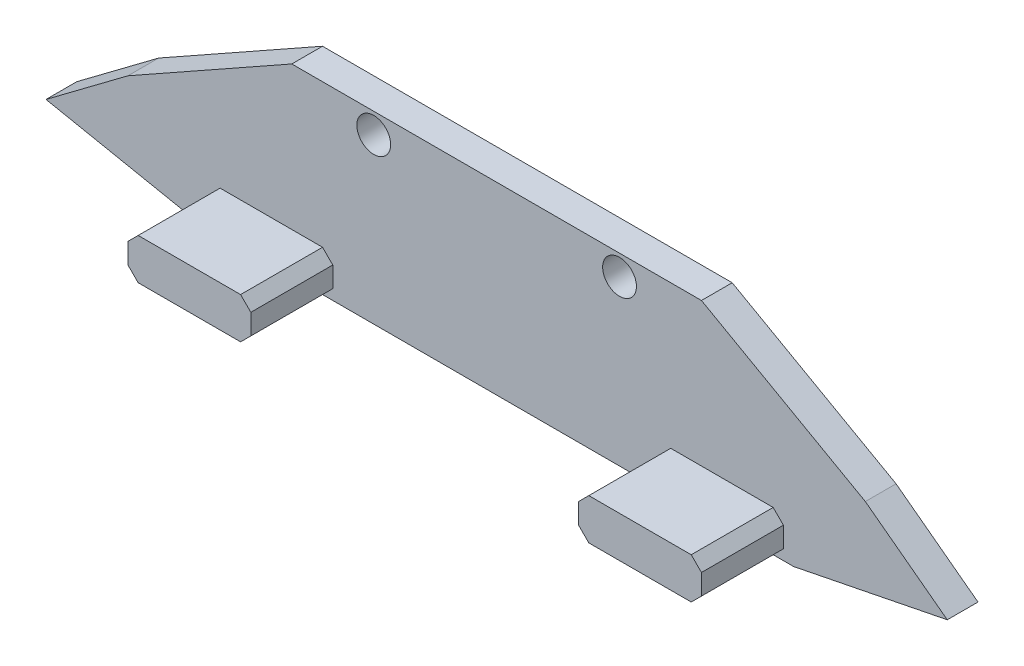
ISO-10303-21;
HEADER;
FILE_DESCRIPTION(('STEP AP214'),'2;1');
FILE_NAME('part.step','',(''),(''),'','','');
FILE_SCHEMA(('AUTOMOTIVE_DESIGN { 1 0 10303 214 1 1 1 1 }'));
ENDSEC;
DATA;
#1=APPLICATION_CONTEXT('core data for automotive mechanical design processes');
#2=APPLICATION_PROTOCOL_DEFINITION('international standard','automotive_design',2000,#1);
#3=PRODUCT_CONTEXT('',#1,'mechanical');
#4=PRODUCT('Part','Part','',(#3));
#5=PRODUCT_RELATED_PRODUCT_CATEGORY('part','',(#4));
#6=PRODUCT_DEFINITION_FORMATION('','',#4);
#7=PRODUCT_DEFINITION_CONTEXT('part definition',#1,'design');
#8=PRODUCT_DEFINITION('design','',#6,#7);
#9=PRODUCT_DEFINITION_SHAPE('','',#8);
#10=(LENGTH_UNIT() NAMED_UNIT(*) SI_UNIT(.MILLI.,.METRE.));
#11=(NAMED_UNIT(*) PLANE_ANGLE_UNIT() SI_UNIT($,.RADIAN.));
#12=(NAMED_UNIT(*) SI_UNIT($,.STERADIAN.) SOLID_ANGLE_UNIT());
#13=UNCERTAINTY_MEASURE_WITH_UNIT(LENGTH_MEASURE(1.E-05),#10,'distance_accuracy_value','');
#14=(GEOMETRIC_REPRESENTATION_CONTEXT(3) GLOBAL_UNCERTAINTY_ASSIGNED_CONTEXT((#13)) GLOBAL_UNIT_ASSIGNED_CONTEXT((#10,
#11,#12)) REPRESENTATION_CONTEXT('',''));
#15=CARTESIAN_POINT('',(0.,0.,0.));
#16=DIRECTION('',(0.,0.,1.));
#17=DIRECTION('',(1.,0.,0.));
#18=AXIS2_PLACEMENT_3D('',#15,#16,#17);
#19=CARTESIAN_POINT('',(0.,0.,3.));
#20=DIRECTION('',(0.,0.,-1.));
#21=DIRECTION('',(-1.,0.,0.));
#22=AXIS2_PLACEMENT_3D('',#19,#20,#21);
#23=PLANE('',#22);
#24=CARTESIAN_POINT('',(-12.,89.,3.));
#25=DIRECTION('',(0.,0.,1.));
#26=DIRECTION('',(1.,0.,0.));
#27=AXIS2_PLACEMENT_3D('',#24,#25,#26);
#28=CIRCLE('',#27,1.65);
#29=CARTESIAN_POINT('',(-10.35,89.,3.));
#30=VERTEX_POINT('',#29);
#31=EDGE_CURVE('E297',#30,#30,#28,.T.);
#32=ORIENTED_EDGE('',*,*,#31,.F.);
#33=EDGE_LOOP('',(#32));
#34=FACE_BOUND('',#33,.T.);
#35=CARTESIAN_POINT('',(12.,89.,3.));
#36=DIRECTION('',(0.,0.,1.));
#37=DIRECTION('',(1.,0.,0.));
#38=AXIS2_PLACEMENT_3D('',#35,#36,#37);
#39=CIRCLE('',#38,1.65);
#40=CARTESIAN_POINT('',(13.65,89.,3.));
#41=VERTEX_POINT('',#40);
#42=EDGE_CURVE('E291',#41,#41,#39,.T.);
#43=ORIENTED_EDGE('',*,*,#42,.F.);
#44=EDGE_LOOP('',(#43));
#45=FACE_BOUND('',#44,.T.);
#46=DIRECTION('',(0.707106781186547,-0.707106781186547,0.));
#47=VECTOR('',#46,1.);
#48=CARTESIAN_POINT('',(16.,74.,3.));
#49=LINE('',#48,#47);
#50=CARTESIAN_POINT('',(16.,74.,3.));
#51=VERTEX_POINT('',#50);
#52=CARTESIAN_POINT('',(17.,73.,3.));
#53=VERTEX_POINT('',#52);
#54=EDGE_CURVE('E222',#51,#53,#49,.T.);
#55=ORIENTED_EDGE('',*,*,#54,.F.);
#56=DIRECTION('',(0.,-1.,0.));
#57=VECTOR('',#56,1.);
#58=CARTESIAN_POINT('',(16.,76.,3.));
#59=LINE('',#58,#57);
#60=CARTESIAN_POINT('',(16.,76.,3.));
#61=VERTEX_POINT('',#60);
#62=EDGE_CURVE('E219',#61,#51,#59,.T.);
#63=ORIENTED_EDGE('',*,*,#62,.F.);
#64=DIRECTION('',(-0.707106781186547,-0.707106781186547,0.));
#65=VECTOR('',#64,1.);
#66=CARTESIAN_POINT('',(17.,77.,3.));
#67=LINE('',#66,#65);
#68=CARTESIAN_POINT('',(17.,77.,3.));
#69=VERTEX_POINT('',#68);
#70=EDGE_CURVE('E729',#69,#61,#67,.T.);
#71=ORIENTED_EDGE('',*,*,#70,.F.);
#72=DIRECTION('',(-1.,0.,0.));
#73=VECTOR('',#72,1.);
#74=CARTESIAN_POINT('',(27.,77.,3.));
#75=LINE('',#74,#73);
#76=CARTESIAN_POINT('',(27.,77.,3.));
#77=VERTEX_POINT('',#76);
#78=EDGE_CURVE('E755',#77,#69,#75,.T.);
#79=ORIENTED_EDGE('',*,*,#78,.F.);
#80=DIRECTION('',(-0.707106781186547,0.707106781186547,0.));
#81=VECTOR('',#80,1.);
#82=CARTESIAN_POINT('',(28.,76.,3.));
#83=LINE('',#82,#81);
#84=CARTESIAN_POINT('',(28.,76.,3.));
#85=VERTEX_POINT('',#84);
#86=EDGE_CURVE('E58',#85,#77,#83,.T.);
#87=ORIENTED_EDGE('',*,*,#86,.F.);
#88=DIRECTION('',(0.,1.,0.));
#89=VECTOR('',#88,1.);
#90=CARTESIAN_POINT('',(28.,74.,3.));
#91=LINE('',#90,#89);
#92=CARTESIAN_POINT('',(28.,74.,3.));
#93=VERTEX_POINT('',#92);
#94=EDGE_CURVE('E53',#93,#85,#91,.T.);
#95=ORIENTED_EDGE('',*,*,#94,.F.);
#96=DIRECTION('',(0.707106781186547,0.707106781186547,0.));
#97=VECTOR('',#96,1.);
#98=CARTESIAN_POINT('',(27.,73.,3.));
#99=LINE('',#98,#97);
#100=CARTESIAN_POINT('',(27.,73.,3.));
#101=VERTEX_POINT('',#100);
#102=EDGE_CURVE('E379',#101,#93,#99,.T.);
#103=ORIENTED_EDGE('',*,*,#102,.F.);
#104=DIRECTION('',(1.,0.,0.));
#105=VECTOR('',#104,1.);
#106=CARTESIAN_POINT('',(-29.,73.,3.));
#107=LINE('',#106,#105);
#108=CARTESIAN_POINT('',(29.,73.,3.));
#109=VERTEX_POINT('',#108);
#110=EDGE_CURVE('E306',#101,#109,#107,.T.);
#111=ORIENTED_EDGE('',*,*,#110,.T.);
#112=DIRECTION('',(0.98058067569092,0.196116135138184,0.));
#113=VECTOR('',#112,1.);
#114=CARTESIAN_POINT('',(29.,73.,3.));
#115=LINE('',#114,#113);
#116=CARTESIAN_POINT('',(44.,76.,3.));
#117=VERTEX_POINT('',#116);
#118=EDGE_CURVE('E310',#109,#117,#115,.T.);
#119=ORIENTED_EDGE('',*,*,#118,.T.);
#120=DIRECTION('',(-0.8,0.6,0.));
#121=VECTOR('',#120,1.);
#122=CARTESIAN_POINT('',(44.,76.,3.));
#123=LINE('',#122,#121);
#124=CARTESIAN_POINT('',(36.,82.,3.));
#125=VERTEX_POINT('',#124);
#126=EDGE_CURVE('E313',#117,#125,#123,.T.);
#127=ORIENTED_EDGE('',*,*,#126,.T.);
#128=DIRECTION('',(-0.871575537124549,0.490261239632559,0.));
#129=VECTOR('',#128,1.);
#130=CARTESIAN_POINT('',(36.,82.,3.));
#131=LINE('',#130,#129);
#132=CARTESIAN_POINT('',(20.,91.,3.));
#133=VERTEX_POINT('',#132);
#134=EDGE_CURVE('E315',#125,#133,#131,.T.);
#135=ORIENTED_EDGE('',*,*,#134,.T.);
#136=DIRECTION('',(-1.,0.,0.));
#137=VECTOR('',#136,1.);
#138=CARTESIAN_POINT('',(20.,91.,3.));
#139=LINE('',#138,#137);
#140=CARTESIAN_POINT('',(-20.,91.,3.));
#141=VERTEX_POINT('',#140);
#142=EDGE_CURVE('E317',#133,#141,#139,.T.);
#143=ORIENTED_EDGE('',*,*,#142,.T.);
#144=DIRECTION('',(-0.871575537124549,-0.490261239632559,0.));
#145=VECTOR('',#144,1.);
#146=CARTESIAN_POINT('',(-20.,91.,3.));
#147=LINE('',#146,#145);
#148=CARTESIAN_POINT('',(-36.,82.,3.));
#149=VERTEX_POINT('',#148);
#150=EDGE_CURVE('E319',#141,#149,#147,.T.);
#151=ORIENTED_EDGE('',*,*,#150,.T.);
#152=DIRECTION('',(-0.8,-0.6,0.));
#153=VECTOR('',#152,1.);
#154=CARTESIAN_POINT('',(-36.,82.,3.));
#155=LINE('',#154,#153);
#156=CARTESIAN_POINT('',(-44.,76.,3.));
#157=VERTEX_POINT('',#156);
#158=EDGE_CURVE('E321',#149,#157,#155,.T.);
#159=ORIENTED_EDGE('',*,*,#158,.T.);
#160=DIRECTION('',(0.98058067569092,-0.196116135138184,0.));
#161=VECTOR('',#160,1.);
#162=CARTESIAN_POINT('',(-44.,76.,3.));
#163=LINE('',#162,#161);
#164=CARTESIAN_POINT('',(-29.,73.,3.));
#165=VERTEX_POINT('',#164);
#166=EDGE_CURVE('E303',#157,#165,#163,.T.);
#167=ORIENTED_EDGE('',*,*,#166,.T.);
#168=CARTESIAN_POINT('',(-27.,73.,3.));
#169=VERTEX_POINT('',#168);
#170=EDGE_CURVE('E308',#165,#169,#107,.T.);
#171=ORIENTED_EDGE('',*,*,#170,.T.);
#172=DIRECTION('',(0.707106781186547,-0.707106781186547,0.));
#173=VECTOR('',#172,1.);
#174=CARTESIAN_POINT('',(-28.,74.,3.));
#175=LINE('',#174,#173);
#176=CARTESIAN_POINT('',(-28.,74.,3.));
#177=VERTEX_POINT('',#176);
#178=EDGE_CURVE('E223',#177,#169,#175,.T.);
#179=ORIENTED_EDGE('',*,*,#178,.F.);
#180=DIRECTION('',(0.,-1.,0.));
#181=VECTOR('',#180,1.);
#182=CARTESIAN_POINT('',(-28.,76.,3.));
#183=LINE('',#182,#181);
#184=CARTESIAN_POINT('',(-28.,76.,3.));
#185=VERTEX_POINT('',#184);
#186=EDGE_CURVE('E236',#185,#177,#183,.T.);
#187=ORIENTED_EDGE('',*,*,#186,.F.);
#188=DIRECTION('',(-0.707106781186547,-0.707106781186547,0.));
#189=VECTOR('',#188,1.);
#190=CARTESIAN_POINT('',(-27.,77.,3.));
#191=LINE('',#190,#189);
#192=CARTESIAN_POINT('',(-27.,77.,3.));
#193=VERTEX_POINT('',#192);
#194=EDGE_CURVE('E262',#193,#185,#191,.T.);
#195=ORIENTED_EDGE('',*,*,#194,.F.);
#196=DIRECTION('',(-1.,0.,0.));
#197=VECTOR('',#196,1.);
#198=CARTESIAN_POINT('',(-17.,77.,3.));
#199=LINE('',#198,#197);
#200=CARTESIAN_POINT('',(-17.,77.,3.));
#201=VERTEX_POINT('',#200);
#202=EDGE_CURVE('E259',#201,#193,#199,.T.);
#203=ORIENTED_EDGE('',*,*,#202,.F.);
#204=DIRECTION('',(-0.707106781186547,0.707106781186547,0.));
#205=VECTOR('',#204,1.);
#206=CARTESIAN_POINT('',(-16.,76.,3.));
#207=LINE('',#206,#205);
#208=CARTESIAN_POINT('',(-16.,76.,3.));
#209=VERTEX_POINT('',#208);
#210=EDGE_CURVE('E256',#209,#201,#207,.T.);
#211=ORIENTED_EDGE('',*,*,#210,.F.);
#212=DIRECTION('',(0.,1.,0.));
#213=VECTOR('',#212,1.);
#214=CARTESIAN_POINT('',(-16.,74.,3.));
#215=LINE('',#214,#213);
#216=CARTESIAN_POINT('',(-16.,74.,3.));
#217=VERTEX_POINT('',#216);
#218=EDGE_CURVE('E253',#217,#209,#215,.T.);
#219=ORIENTED_EDGE('',*,*,#218,.F.);
#220=DIRECTION('',(0.707106781186547,0.707106781186547,0.));
#221=VECTOR('',#220,1.);
#222=CARTESIAN_POINT('',(-17.,73.,3.));
#223=LINE('',#222,#221);
#224=CARTESIAN_POINT('',(-17.,73.,3.));
#225=VERTEX_POINT('',#224);
#226=EDGE_CURVE('E226',#225,#217,#223,.T.);
#227=ORIENTED_EDGE('',*,*,#226,.F.);
#228=EDGE_CURVE('E311',#225,#53,#107,.T.);
#229=ORIENTED_EDGE('',*,*,#228,.T.);
#230=EDGE_LOOP('',(#55,#63,#71,#79,#87,#95,#103,#111,#119,#127,#135,#143,#151,#159,#167,#171,
#179,#187,#195,#203,#211,#219,#227,#229));
#231=FACE_BOUND('',#230,.T.);
#232=ADVANCED_FACE('F38',(#34,#45,#231),#23,.F.);
#233=CARTESIAN_POINT('',(0.,0.,0.));
#234=DIRECTION('',(0.,0.,-1.));
#235=DIRECTION('',(-1.,0.,0.));
#236=AXIS2_PLACEMENT_3D('',#233,#234,#235);
#237=PLANE('',#236);
#238=CARTESIAN_POINT('',(-12.,89.,0.));
#239=DIRECTION('',(0.,0.,1.));
#240=DIRECTION('',(1.,0.,0.));
#241=AXIS2_PLACEMENT_3D('',#238,#239,#240);
#242=CIRCLE('',#241,1.65);
#243=CARTESIAN_POINT('',(-10.35,89.,0.));
#244=VERTEX_POINT('',#243);
#245=EDGE_CURVE('E294',#244,#244,#242,.T.);
#246=ORIENTED_EDGE('',*,*,#245,.T.);
#247=EDGE_LOOP('',(#246));
#248=FACE_BOUND('',#247,.T.);
#249=DIRECTION('',(0.98058067569092,-0.196116135138184,0.));
#250=VECTOR('',#249,1.);
#251=CARTESIAN_POINT('',(-44.,76.,0.));
#252=LINE('',#251,#250);
#253=CARTESIAN_POINT('',(-44.,76.,0.));
#254=VERTEX_POINT('',#253);
#255=CARTESIAN_POINT('',(-29.,73.,0.));
#256=VERTEX_POINT('',#255);
#257=EDGE_CURVE('E300',#254,#256,#252,.T.);
#258=ORIENTED_EDGE('',*,*,#257,.F.);
#259=DIRECTION('',(-0.8,-0.6,0.));
#260=VECTOR('',#259,1.);
#261=CARTESIAN_POINT('',(-36.,82.,0.));
#262=LINE('',#261,#260);
#263=CARTESIAN_POINT('',(-36.,82.,0.));
#264=VERTEX_POINT('',#263);
#265=EDGE_CURVE('E307',#264,#254,#262,.T.);
#266=ORIENTED_EDGE('',*,*,#265,.F.);
#267=DIRECTION('',(-0.871575537124549,-0.490261239632559,0.));
#268=VECTOR('',#267,1.);
#269=CARTESIAN_POINT('',(-20.,91.,0.));
#270=LINE('',#269,#268);
#271=CARTESIAN_POINT('',(-20.,91.,0.));
#272=VERTEX_POINT('',#271);
#273=EDGE_CURVE('E336',#272,#264,#270,.T.);
#274=ORIENTED_EDGE('',*,*,#273,.F.);
#275=DIRECTION('',(-1.,0.,0.));
#276=VECTOR('',#275,1.);
#277=CARTESIAN_POINT('',(20.,91.,0.));
#278=LINE('',#277,#276);
#279=CARTESIAN_POINT('',(20.,91.,0.));
#280=VERTEX_POINT('',#279);
#281=EDGE_CURVE('E334',#280,#272,#278,.T.);
#282=ORIENTED_EDGE('',*,*,#281,.F.);
#283=DIRECTION('',(-0.871575537124549,0.490261239632559,0.));
#284=VECTOR('',#283,1.);
#285=CARTESIAN_POINT('',(36.,82.,0.));
#286=LINE('',#285,#284);
#287=CARTESIAN_POINT('',(36.,82.,0.));
#288=VERTEX_POINT('',#287);
#289=EDGE_CURVE('E332',#288,#280,#286,.T.);
#290=ORIENTED_EDGE('',*,*,#289,.F.);
#291=DIRECTION('',(-0.8,0.6,0.));
#292=VECTOR('',#291,1.);
#293=CARTESIAN_POINT('',(44.,76.,0.));
#294=LINE('',#293,#292);
#295=CARTESIAN_POINT('',(44.,76.,0.));
#296=VERTEX_POINT('',#295);
#297=EDGE_CURVE('E330',#296,#288,#294,.T.);
#298=ORIENTED_EDGE('',*,*,#297,.F.);
#299=DIRECTION('',(0.98058067569092,0.196116135138184,0.));
#300=VECTOR('',#299,1.);
#301=CARTESIAN_POINT('',(29.,73.,0.));
#302=LINE('',#301,#300);
#303=CARTESIAN_POINT('',(29.,73.,0.));
#304=VERTEX_POINT('',#303);
#305=EDGE_CURVE('E328',#304,#296,#302,.T.);
#306=ORIENTED_EDGE('',*,*,#305,.F.);
#307=DIRECTION('',(1.,0.,0.));
#308=VECTOR('',#307,1.);
#309=CARTESIAN_POINT('',(-29.,73.,0.));
#310=LINE('',#309,#308);
#311=EDGE_CURVE('E326',#256,#304,#310,.T.);
#312=ORIENTED_EDGE('',*,*,#311,.F.);
#313=EDGE_LOOP('',(#258,#266,#274,#282,#290,#298,#306,#312));
#314=FACE_BOUND('',#313,.T.);
#315=CARTESIAN_POINT('',(12.,89.,0.));
#316=DIRECTION('',(0.,0.,1.));
#317=DIRECTION('',(1.,0.,0.));
#318=AXIS2_PLACEMENT_3D('',#315,#316,#317);
#319=CIRCLE('',#318,1.65);
#320=CARTESIAN_POINT('',(13.65,89.,0.));
#321=VERTEX_POINT('',#320);
#322=EDGE_CURVE('E290',#321,#321,#319,.T.);
#323=ORIENTED_EDGE('',*,*,#322,.T.);
#324=EDGE_LOOP('',(#323));
#325=FACE_BOUND('',#324,.T.);
#326=ADVANCED_FACE('F365',(#248,#314,#325),#237,.T.);
#327=CARTESIAN_POINT('',(-44.,76.,3.));
#328=DIRECTION('',(0.196116135138184,0.98058067569092,0.));
#329=DIRECTION('',(-0.98058067569092,0.196116135138184,0.));
#330=AXIS2_PLACEMENT_3D('',#327,#328,#329);
#331=PLANE('',#330);
#332=ORIENTED_EDGE('',*,*,#257,.T.);
#333=DIRECTION('',(0.,0.,-1.));
#334=VECTOR('',#333,1.);
#335=CARTESIAN_POINT('',(-29.,73.,3.));
#336=LINE('',#335,#334);
#337=EDGE_CURVE('E11',#165,#256,#336,.T.);
#338=ORIENTED_EDGE('',*,*,#337,.F.);
#339=ORIENTED_EDGE('',*,*,#166,.F.);
#340=DIRECTION('',(0.,0.,-1.));
#341=VECTOR('',#340,1.);
#342=CARTESIAN_POINT('',(-44.,76.,3.));
#343=LINE('',#342,#341);
#344=EDGE_CURVE('E323',#157,#254,#343,.T.);
#345=ORIENTED_EDGE('',*,*,#344,.T.);
#346=EDGE_LOOP('',(#332,#338,#339,#345));
#347=FACE_BOUND('',#346,.T.);
#348=ADVANCED_FACE('F40',(#347),#331,.F.);
#349=CARTESIAN_POINT('',(-29.,73.,3.));
#350=DIRECTION('',(0.,1.,0.));
#351=DIRECTION('',(0.,0.,1.));
#352=AXIS2_PLACEMENT_3D('',#349,#350,#351);
#353=PLANE('',#352);
#354=ORIENTED_EDGE('',*,*,#311,.T.);
#355=DIRECTION('',(0.,0.,-1.));
#356=VECTOR('',#355,1.);
#357=CARTESIAN_POINT('',(29.,73.,3.));
#358=LINE('',#357,#356);
#359=EDGE_CURVE('E46',#109,#304,#358,.T.);
#360=ORIENTED_EDGE('',*,*,#359,.F.);
#361=ORIENTED_EDGE('',*,*,#110,.F.);
#362=DIRECTION('',(0.,0.,-1.));
#363=VECTOR('',#362,1.);
#364=CARTESIAN_POINT('',(27.,73.,11.));
#365=LINE('',#364,#363);
#366=CARTESIAN_POINT('',(27.,73.,11.));
#367=VERTEX_POINT('',#366);
#368=EDGE_CURVE('E206',#367,#101,#365,.T.);
#369=ORIENTED_EDGE('',*,*,#368,.F.);
#370=DIRECTION('',(1.,0.,0.));
#371=VECTOR('',#370,1.);
#372=CARTESIAN_POINT('',(17.,73.,11.));
#373=LINE('',#372,#371);
#374=CARTESIAN_POINT('',(17.,73.,11.));
#375=VERTEX_POINT('',#374);
#376=EDGE_CURVE('E198',#375,#367,#373,.T.);
#377=ORIENTED_EDGE('',*,*,#376,.F.);
#378=DIRECTION('',(0.,0.,-1.));
#379=VECTOR('',#378,1.);
#380=CARTESIAN_POINT('',(17.,73.,11.));
#381=LINE('',#380,#379);
#382=EDGE_CURVE('E203',#375,#53,#381,.T.);
#383=ORIENTED_EDGE('',*,*,#382,.T.);
#384=ORIENTED_EDGE('',*,*,#228,.F.);
#385=DIRECTION('',(0.,0.,-1.));
#386=VECTOR('',#385,1.);
#387=CARTESIAN_POINT('',(-17.,73.,11.));
#388=LINE('',#387,#386);
#389=CARTESIAN_POINT('',(-17.,73.,11.));
#390=VERTEX_POINT('',#389);
#391=EDGE_CURVE('E284',#390,#225,#388,.T.);
#392=ORIENTED_EDGE('',*,*,#391,.F.);
#393=DIRECTION('',(1.,0.,0.));
#394=VECTOR('',#393,1.);
#395=CARTESIAN_POINT('',(-27.,73.,11.));
#396=LINE('',#395,#394);
#397=CARTESIAN_POINT('',(-27.,73.,11.));
#398=VERTEX_POINT('',#397);
#399=EDGE_CURVE('E235',#398,#390,#396,.T.);
#400=ORIENTED_EDGE('',*,*,#399,.F.);
#401=DIRECTION('',(0.,0.,-1.));
#402=VECTOR('',#401,1.);
#403=CARTESIAN_POINT('',(-27.,73.,11.));
#404=LINE('',#403,#402);
#405=EDGE_CURVE('E287',#398,#169,#404,.T.);
#406=ORIENTED_EDGE('',*,*,#405,.T.);
#407=ORIENTED_EDGE('',*,*,#170,.F.);
#408=ORIENTED_EDGE('',*,*,#337,.T.);
#409=EDGE_LOOP('',(#354,#360,#361,#369,#377,#383,#384,#392,#400,#406,#407,#408));
#410=FACE_BOUND('',#409,.T.);
#411=ADVANCED_FACE('F200',(#410),#353,.F.);
#412=CARTESIAN_POINT('',(29.,73.,3.));
#413=DIRECTION('',(-0.196116135138184,0.98058067569092,0.));
#414=DIRECTION('',(-0.98058067569092,-0.196116135138184,0.));
#415=AXIS2_PLACEMENT_3D('',#412,#413,#414);
#416=PLANE('',#415);
#417=ORIENTED_EDGE('',*,*,#305,.T.);
#418=DIRECTION('',(0.,0.,-1.));
#419=VECTOR('',#418,1.);
#420=CARTESIAN_POINT('',(44.,76.,3.));
#421=LINE('',#420,#419);
#422=EDGE_CURVE('E353',#117,#296,#421,.T.);
#423=ORIENTED_EDGE('',*,*,#422,.F.);
#424=ORIENTED_EDGE('',*,*,#118,.F.);
#425=ORIENTED_EDGE('',*,*,#359,.T.);
#426=EDGE_LOOP('',(#417,#423,#424,#425));
#427=FACE_BOUND('',#426,.T.);
#428=ADVANCED_FACE('F360',(#427),#416,.F.);
#429=CARTESIAN_POINT('',(44.,76.,3.));
#430=DIRECTION('',(-0.6,-0.8,0.));
#431=DIRECTION('',(0.8,-0.6,0.));
#432=AXIS2_PLACEMENT_3D('',#429,#430,#431);
#433=PLANE('',#432);
#434=ORIENTED_EDGE('',*,*,#297,.T.);
#435=DIRECTION('',(0.,0.,-1.));
#436=VECTOR('',#435,1.);
#437=CARTESIAN_POINT('',(36.,82.,3.));
#438=LINE('',#437,#436);
#439=EDGE_CURVE('E350',#125,#288,#438,.T.);
#440=ORIENTED_EDGE('',*,*,#439,.F.);
#441=ORIENTED_EDGE('',*,*,#126,.F.);
#442=ORIENTED_EDGE('',*,*,#422,.T.);
#443=EDGE_LOOP('',(#434,#440,#441,#442));
#444=FACE_BOUND('',#443,.T.);
#445=ADVANCED_FACE('F371',(#444),#433,.F.);
#446=CARTESIAN_POINT('',(36.,82.,3.));
#447=DIRECTION('',(-0.490261239632559,-0.871575537124549,0.));
#448=DIRECTION('',(0.871575537124549,-0.490261239632559,0.));
#449=AXIS2_PLACEMENT_3D('',#446,#447,#448);
#450=PLANE('',#449);
#451=ORIENTED_EDGE('',*,*,#289,.T.);
#452=DIRECTION('',(0.,0.,-1.));
#453=VECTOR('',#452,1.);
#454=CARTESIAN_POINT('',(20.,91.,3.));
#455=LINE('',#454,#453);
#456=EDGE_CURVE('E347',#133,#280,#455,.T.);
#457=ORIENTED_EDGE('',*,*,#456,.F.);
#458=ORIENTED_EDGE('',*,*,#134,.F.);
#459=ORIENTED_EDGE('',*,*,#439,.T.);
#460=EDGE_LOOP('',(#451,#457,#458,#459));
#461=FACE_BOUND('',#460,.T.);
#462=ADVANCED_FACE('F375',(#461),#450,.F.);
#463=CARTESIAN_POINT('',(20.,91.,3.));
#464=DIRECTION('',(0.,-1.,0.));
#465=DIRECTION('',(0.,0.,-1.));
#466=AXIS2_PLACEMENT_3D('',#463,#464,#465);
#467=PLANE('',#466);
#468=ORIENTED_EDGE('',*,*,#281,.T.);
#469=DIRECTION('',(0.,0.,-1.));
#470=VECTOR('',#469,1.);
#471=CARTESIAN_POINT('',(-20.,91.,3.));
#472=LINE('',#471,#470);
#473=EDGE_CURVE('E344',#141,#272,#472,.T.);
#474=ORIENTED_EDGE('',*,*,#473,.F.);
#475=ORIENTED_EDGE('',*,*,#142,.F.);
#476=ORIENTED_EDGE('',*,*,#456,.T.);
#477=EDGE_LOOP('',(#468,#474,#475,#476));
#478=FACE_BOUND('',#477,.T.);
#479=ADVANCED_FACE('F441',(#478),#467,.F.);
#480=CARTESIAN_POINT('',(-20.,91.,3.));
#481=DIRECTION('',(0.490261239632559,-0.871575537124549,0.));
#482=DIRECTION('',(0.871575537124549,0.490261239632559,0.));
#483=AXIS2_PLACEMENT_3D('',#480,#481,#482);
#484=PLANE('',#483);
#485=ORIENTED_EDGE('',*,*,#273,.T.);
#486=DIRECTION('',(0.,0.,-1.));
#487=VECTOR('',#486,1.);
#488=CARTESIAN_POINT('',(-36.,82.,3.));
#489=LINE('',#488,#487);
#490=EDGE_CURVE('E341',#149,#264,#489,.T.);
#491=ORIENTED_EDGE('',*,*,#490,.F.);
#492=ORIENTED_EDGE('',*,*,#150,.F.);
#493=ORIENTED_EDGE('',*,*,#473,.T.);
#494=EDGE_LOOP('',(#485,#491,#492,#493));
#495=FACE_BOUND('',#494,.T.);
#496=ADVANCED_FACE('F437',(#495),#484,.F.);
#497=CARTESIAN_POINT('',(-36.,82.,3.));
#498=DIRECTION('',(0.6,-0.8,0.));
#499=DIRECTION('',(0.8,0.6,0.));
#500=AXIS2_PLACEMENT_3D('',#497,#498,#499);
#501=PLANE('',#500);
#502=ORIENTED_EDGE('',*,*,#265,.T.);
#503=ORIENTED_EDGE('',*,*,#344,.F.);
#504=ORIENTED_EDGE('',*,*,#158,.F.);
#505=ORIENTED_EDGE('',*,*,#490,.T.);
#506=EDGE_LOOP('',(#502,#503,#504,#505));
#507=FACE_BOUND('',#506,.T.);
#508=ADVANCED_FACE('F434',(#507),#501,.F.);
#509=CARTESIAN_POINT('',(-12.,89.,3.));
#510=DIRECTION('',(0.,0.,-1.));
#511=DIRECTION('',(-1.,0.,0.));
#512=AXIS2_PLACEMENT_3D('',#509,#510,#511);
#513=CYLINDRICAL_SURFACE('',#512,1.65);
#514=ORIENTED_EDGE('',*,*,#31,.T.);
#515=EDGE_LOOP('',(#514));
#516=FACE_BOUND('',#515,.T.);
#517=ORIENTED_EDGE('',*,*,#245,.F.);
#518=EDGE_LOOP('',(#517));
#519=FACE_BOUND('',#518,.T.);
#520=ADVANCED_FACE('F431',(#516,#519),#513,.F.);
#521=CARTESIAN_POINT('',(12.,89.,3.));
#522=DIRECTION('',(0.,0.,-1.));
#523=DIRECTION('',(-1.,0.,0.));
#524=AXIS2_PLACEMENT_3D('',#521,#522,#523);
#525=CYLINDRICAL_SURFACE('',#524,1.65);
#526=ORIENTED_EDGE('',*,*,#42,.T.);
#527=EDGE_LOOP('',(#526));
#528=FACE_BOUND('',#527,.T.);
#529=ORIENTED_EDGE('',*,*,#322,.F.);
#530=EDGE_LOOP('',(#529));
#531=FACE_BOUND('',#530,.T.);
#532=ADVANCED_FACE('F539',(#528,#531),#525,.F.);
#533=CARTESIAN_POINT('',(-28.,74.,11.));
#534=DIRECTION('',(0.707106781186547,0.707106781186547,0.));
#535=DIRECTION('',(-0.707106781186548,0.707106781186548,0.));
#536=AXIS2_PLACEMENT_3D('',#533,#534,#535);
#537=PLANE('',#536);
#538=ORIENTED_EDGE('',*,*,#178,.T.);
#539=ORIENTED_EDGE('',*,*,#405,.F.);
#540=DIRECTION('',(0.707106781186547,-0.707106781186547,0.));
#541=VECTOR('',#540,1.);
#542=CARTESIAN_POINT('',(-28.,74.,11.));
#543=LINE('',#542,#541);
#544=CARTESIAN_POINT('',(-28.,74.,11.));
#545=VERTEX_POINT('',#544);
#546=EDGE_CURVE('E232',#545,#398,#543,.T.);
#547=ORIENTED_EDGE('',*,*,#546,.F.);
#548=DIRECTION('',(0.,0.,-1.));
#549=VECTOR('',#548,1.);
#550=CARTESIAN_POINT('',(-28.,74.,11.));
#551=LINE('',#550,#549);
#552=EDGE_CURVE('E249',#545,#177,#551,.T.);
#553=ORIENTED_EDGE('',*,*,#552,.T.);
#554=EDGE_LOOP('',(#538,#539,#547,#553));
#555=FACE_BOUND('',#554,.T.);
#556=ADVANCED_FACE('F393',(#555),#537,.F.);
#557=CARTESIAN_POINT('',(-17.,73.,11.));
#558=DIRECTION('',(-0.707106781186547,0.707106781186547,0.));
#559=DIRECTION('',(-0.707106781186548,-0.707106781186548,0.));
#560=AXIS2_PLACEMENT_3D('',#557,#558,#559);
#561=PLANE('',#560);
#562=ORIENTED_EDGE('',*,*,#226,.T.);
#563=DIRECTION('',(0.,0.,-1.));
#564=VECTOR('',#563,1.);
#565=CARTESIAN_POINT('',(-16.,74.,11.));
#566=LINE('',#565,#564);
#567=CARTESIAN_POINT('',(-16.,74.,11.));
#568=VERTEX_POINT('',#567);
#569=EDGE_CURVE('E281',#568,#217,#566,.T.);
#570=ORIENTED_EDGE('',*,*,#569,.F.);
#571=DIRECTION('',(0.707106781186547,0.707106781186547,0.));
#572=VECTOR('',#571,1.);
#573=CARTESIAN_POINT('',(-17.,73.,11.));
#574=LINE('',#573,#572);
#575=EDGE_CURVE('E238',#390,#568,#574,.T.);
#576=ORIENTED_EDGE('',*,*,#575,.F.);
#577=ORIENTED_EDGE('',*,*,#391,.T.);
#578=EDGE_LOOP('',(#562,#570,#576,#577));
#579=FACE_BOUND('',#578,.T.);
#580=ADVANCED_FACE('F384',(#579),#561,.F.);
#581=CARTESIAN_POINT('',(-16.,74.,11.));
#582=DIRECTION('',(-1.,0.,0.));
#583=DIRECTION('',(0.,0.,1.));
#584=AXIS2_PLACEMENT_3D('',#581,#582,#583);
#585=PLANE('',#584);
#586=ORIENTED_EDGE('',*,*,#218,.T.);
#587=DIRECTION('',(0.,0.,-1.));
#588=VECTOR('',#587,1.);
#589=CARTESIAN_POINT('',(-16.,76.,11.));
#590=LINE('',#589,#588);
#591=CARTESIAN_POINT('',(-16.,76.,11.));
#592=VERTEX_POINT('',#591);
#593=EDGE_CURVE('E278',#592,#209,#590,.T.);
#594=ORIENTED_EDGE('',*,*,#593,.F.);
#595=DIRECTION('',(0.,1.,0.));
#596=VECTOR('',#595,1.);
#597=CARTESIAN_POINT('',(-16.,74.,11.));
#598=LINE('',#597,#596);
#599=EDGE_CURVE('E240',#568,#592,#598,.T.);
#600=ORIENTED_EDGE('',*,*,#599,.F.);
#601=ORIENTED_EDGE('',*,*,#569,.T.);
#602=EDGE_LOOP('',(#586,#594,#600,#601));
#603=FACE_BOUND('',#602,.T.);
#604=ADVANCED_FACE('F411',(#603),#585,.F.);
#605=CARTESIAN_POINT('',(-16.,76.,11.));
#606=DIRECTION('',(-0.707106781186547,-0.707106781186547,0.));
#607=DIRECTION('',(0.707106781186548,-0.707106781186548,0.));
#608=AXIS2_PLACEMENT_3D('',#605,#606,#607);
#609=PLANE('',#608);
#610=ORIENTED_EDGE('',*,*,#210,.T.);
#611=DIRECTION('',(0.,0.,-1.));
#612=VECTOR('',#611,1.);
#613=CARTESIAN_POINT('',(-17.,77.,11.));
#614=LINE('',#613,#612);
#615=CARTESIAN_POINT('',(-17.,77.,11.));
#616=VERTEX_POINT('',#615);
#617=EDGE_CURVE('E275',#616,#201,#614,.T.);
#618=ORIENTED_EDGE('',*,*,#617,.F.);
#619=DIRECTION('',(-0.707106781186547,0.707106781186547,0.));
#620=VECTOR('',#619,1.);
#621=CARTESIAN_POINT('',(-16.,76.,11.));
#622=LINE('',#621,#620);
#623=EDGE_CURVE('E242',#592,#616,#622,.T.);
#624=ORIENTED_EDGE('',*,*,#623,.F.);
#625=ORIENTED_EDGE('',*,*,#593,.T.);
#626=EDGE_LOOP('',(#610,#618,#624,#625));
#627=FACE_BOUND('',#626,.T.);
#628=ADVANCED_FACE('F409',(#627),#609,.F.);
#629=CARTESIAN_POINT('',(-17.,77.,11.));
#630=DIRECTION('',(0.,-1.,0.));
#631=DIRECTION('',(0.,0.,-1.));
#632=AXIS2_PLACEMENT_3D('',#629,#630,#631);
#633=PLANE('',#632);
#634=ORIENTED_EDGE('',*,*,#202,.T.);
#635=DIRECTION('',(0.,0.,-1.));
#636=VECTOR('',#635,1.);
#637=CARTESIAN_POINT('',(-27.,77.,11.));
#638=LINE('',#637,#636);
#639=CARTESIAN_POINT('',(-27.,77.,11.));
#640=VERTEX_POINT('',#639);
#641=EDGE_CURVE('E272',#640,#193,#638,.T.);
#642=ORIENTED_EDGE('',*,*,#641,.F.);
#643=DIRECTION('',(-1.,0.,0.));
#644=VECTOR('',#643,1.);
#645=CARTESIAN_POINT('',(-17.,77.,11.));
#646=LINE('',#645,#644);
#647=EDGE_CURVE('E244',#616,#640,#646,.T.);
#648=ORIENTED_EDGE('',*,*,#647,.F.);
#649=ORIENTED_EDGE('',*,*,#617,.T.);
#650=EDGE_LOOP('',(#634,#642,#648,#649));
#651=FACE_BOUND('',#650,.T.);
#652=ADVANCED_FACE('F404',(#651),#633,.F.);
#653=CARTESIAN_POINT('',(-27.,77.,11.));
#654=DIRECTION('',(0.707106781186547,-0.707106781186547,0.));
#655=DIRECTION('',(0.707106781186548,0.707106781186548,0.));
#656=AXIS2_PLACEMENT_3D('',#653,#654,#655);
#657=PLANE('',#656);
#658=ORIENTED_EDGE('',*,*,#194,.T.);
#659=DIRECTION('',(0.,0.,-1.));
#660=VECTOR('',#659,1.);
#661=CARTESIAN_POINT('',(-28.,76.,11.));
#662=LINE('',#661,#660);
#663=CARTESIAN_POINT('',(-28.,76.,11.));
#664=VERTEX_POINT('',#663);
#665=EDGE_CURVE('E269',#664,#185,#662,.T.);
#666=ORIENTED_EDGE('',*,*,#665,.F.);
#667=DIRECTION('',(-0.707106781186547,-0.707106781186547,0.));
#668=VECTOR('',#667,1.);
#669=CARTESIAN_POINT('',(-27.,77.,11.));
#670=LINE('',#669,#668);
#671=EDGE_CURVE('E246',#640,#664,#670,.T.);
#672=ORIENTED_EDGE('',*,*,#671,.F.);
#673=ORIENTED_EDGE('',*,*,#641,.T.);
#674=EDGE_LOOP('',(#658,#666,#672,#673));
#675=FACE_BOUND('',#674,.T.);
#676=ADVANCED_FACE('F401',(#675),#657,.F.);
#677=CARTESIAN_POINT('',(-28.,76.,11.));
#678=DIRECTION('',(1.,0.,0.));
#679=DIRECTION('',(0.,0.,-1.));
#680=AXIS2_PLACEMENT_3D('',#677,#678,#679);
#681=PLANE('',#680);
#682=ORIENTED_EDGE('',*,*,#186,.T.);
#683=ORIENTED_EDGE('',*,*,#552,.F.);
#684=DIRECTION('',(0.,-1.,0.));
#685=VECTOR('',#684,1.);
#686=CARTESIAN_POINT('',(-28.,76.,11.));
#687=LINE('',#686,#685);
#688=EDGE_CURVE('E248',#664,#545,#687,.T.);
#689=ORIENTED_EDGE('',*,*,#688,.F.);
#690=ORIENTED_EDGE('',*,*,#665,.T.);
#691=EDGE_LOOP('',(#682,#683,#689,#690));
#692=FACE_BOUND('',#691,.T.);
#693=ADVANCED_FACE('F396',(#692),#681,.F.);
#694=CARTESIAN_POINT('',(0.,0.,11.));
#695=DIRECTION('',(0.,0.,1.));
#696=DIRECTION('',(1.,0.,0.));
#697=AXIS2_PLACEMENT_3D('',#694,#695,#696);
#698=PLANE('',#697);
#699=ORIENTED_EDGE('',*,*,#546,.T.);
#700=ORIENTED_EDGE('',*,*,#399,.T.);
#701=ORIENTED_EDGE('',*,*,#575,.T.);
#702=ORIENTED_EDGE('',*,*,#599,.T.);
#703=ORIENTED_EDGE('',*,*,#623,.T.);
#704=ORIENTED_EDGE('',*,*,#647,.T.);
#705=ORIENTED_EDGE('',*,*,#671,.T.);
#706=ORIENTED_EDGE('',*,*,#688,.T.);
#707=EDGE_LOOP('',(#699,#700,#701,#702,#703,#704,#705,#706));
#708=FACE_BOUND('',#707,.T.);
#709=ADVANCED_FACE('F388',(#708),#698,.T.);
#710=CARTESIAN_POINT('',(16.,74.,11.));
#711=DIRECTION('',(0.707106781186547,0.707106781186547,0.));
#712=DIRECTION('',(-0.707106781186548,0.707106781186548,0.));
#713=AXIS2_PLACEMENT_3D('',#710,#711,#712);
#714=PLANE('',#713);
#715=ORIENTED_EDGE('',*,*,#54,.T.);
#716=ORIENTED_EDGE('',*,*,#382,.F.);
#717=DIRECTION('',(0.707106781186547,-0.707106781186547,0.));
#718=VECTOR('',#717,1.);
#719=CARTESIAN_POINT('',(16.,74.,11.));
#720=LINE('',#719,#718);
#721=CARTESIAN_POINT('',(16.,74.,11.));
#722=VERTEX_POINT('',#721);
#723=EDGE_CURVE('E210',#722,#375,#720,.T.);
#724=ORIENTED_EDGE('',*,*,#723,.F.);
#725=DIRECTION('',(0.,0.,-1.));
#726=VECTOR('',#725,1.);
#727=CARTESIAN_POINT('',(16.,74.,11.));
#728=LINE('',#727,#726);
#729=EDGE_CURVE('E725',#722,#51,#728,.T.);
#730=ORIENTED_EDGE('',*,*,#729,.T.);
#731=EDGE_LOOP('',(#715,#716,#724,#730));
#732=FACE_BOUND('',#731,.T.);
#733=ADVANCED_FACE('F221',(#732),#714,.F.);
#734=CARTESIAN_POINT('',(27.,73.,11.));
#735=DIRECTION('',(-0.707106781186547,0.707106781186547,0.));
#736=DIRECTION('',(-0.707106781186548,-0.707106781186548,0.));
#737=AXIS2_PLACEMENT_3D('',#734,#735,#736);
#738=PLANE('',#737);
#739=ORIENTED_EDGE('',*,*,#102,.T.);
#740=DIRECTION('',(0.,0.,-1.));
#741=VECTOR('',#740,1.);
#742=CARTESIAN_POINT('',(28.,74.,11.));
#743=LINE('',#742,#741);
#744=CARTESIAN_POINT('',(28.,74.,11.));
#745=VERTEX_POINT('',#744);
#746=EDGE_CURVE('E228',#745,#93,#743,.T.);
#747=ORIENTED_EDGE('',*,*,#746,.F.);
#748=DIRECTION('',(0.707106781186547,0.707106781186547,0.));
#749=VECTOR('',#748,1.);
#750=CARTESIAN_POINT('',(27.,73.,11.));
#751=LINE('',#750,#749);
#752=EDGE_CURVE('E209',#367,#745,#751,.T.);
#753=ORIENTED_EDGE('',*,*,#752,.F.);
#754=ORIENTED_EDGE('',*,*,#368,.T.);
#755=EDGE_LOOP('',(#739,#747,#753,#754));
#756=FACE_BOUND('',#755,.T.);
#757=ADVANCED_FACE('F628',(#756),#738,.F.);
#758=CARTESIAN_POINT('',(28.,74.,11.));
#759=DIRECTION('',(-1.,0.,0.));
#760=DIRECTION('',(0.,0.,1.));
#761=AXIS2_PLACEMENT_3D('',#758,#759,#760);
#762=PLANE('',#761);
#763=ORIENTED_EDGE('',*,*,#94,.T.);
#764=DIRECTION('',(0.,0.,-1.));
#765=VECTOR('',#764,1.);
#766=CARTESIAN_POINT('',(28.,76.,11.));
#767=LINE('',#766,#765);
#768=CARTESIAN_POINT('',(28.,76.,11.));
#769=VERTEX_POINT('',#768);
#770=EDGE_CURVE('E743',#769,#85,#767,.T.);
#771=ORIENTED_EDGE('',*,*,#770,.F.);
#772=DIRECTION('',(0.,1.,0.));
#773=VECTOR('',#772,1.);
#774=CARTESIAN_POINT('',(28.,74.,11.));
#775=LINE('',#774,#773);
#776=EDGE_CURVE('E749',#745,#769,#775,.T.);
#777=ORIENTED_EDGE('',*,*,#776,.F.);
#778=ORIENTED_EDGE('',*,*,#746,.T.);
#779=EDGE_LOOP('',(#763,#771,#777,#778));
#780=FACE_BOUND('',#779,.T.);
#781=ADVANCED_FACE('F638',(#780),#762,.F.);
#782=CARTESIAN_POINT('',(28.,76.,11.));
#783=DIRECTION('',(-0.707106781186547,-0.707106781186547,0.));
#784=DIRECTION('',(0.707106781186548,-0.707106781186548,0.));
#785=AXIS2_PLACEMENT_3D('',#782,#783,#784);
#786=PLANE('',#785);
#787=ORIENTED_EDGE('',*,*,#86,.T.);
#788=DIRECTION('',(0.,0.,-1.));
#789=VECTOR('',#788,1.);
#790=CARTESIAN_POINT('',(27.,77.,11.));
#791=LINE('',#790,#789);
#792=CARTESIAN_POINT('',(27.,77.,11.));
#793=VERTEX_POINT('',#792);
#794=EDGE_CURVE('E740',#793,#77,#791,.T.);
#795=ORIENTED_EDGE('',*,*,#794,.F.);
#796=DIRECTION('',(-0.707106781186547,0.707106781186547,0.));
#797=VECTOR('',#796,1.);
#798=CARTESIAN_POINT('',(28.,76.,11.));
#799=LINE('',#798,#797);
#800=EDGE_CURVE('E763',#769,#793,#799,.T.);
#801=ORIENTED_EDGE('',*,*,#800,.F.);
#802=ORIENTED_EDGE('',*,*,#770,.T.);
#803=EDGE_LOOP('',(#787,#795,#801,#802));
#804=FACE_BOUND('',#803,.T.);
#805=ADVANCED_FACE('F649',(#804),#786,.F.);
#806=CARTESIAN_POINT('',(27.,77.,11.));
#807=DIRECTION('',(0.,-1.,0.));
#808=DIRECTION('',(0.,0.,-1.));
#809=AXIS2_PLACEMENT_3D('',#806,#807,#808);
#810=PLANE('',#809);
#811=ORIENTED_EDGE('',*,*,#78,.T.);
#812=DIRECTION('',(0.,0.,-1.));
#813=VECTOR('',#812,1.);
#814=CARTESIAN_POINT('',(17.,77.,11.));
#815=LINE('',#814,#813);
#816=CARTESIAN_POINT('',(17.,77.,11.));
#817=VERTEX_POINT('',#816);
#818=EDGE_CURVE('E732',#817,#69,#815,.T.);
#819=ORIENTED_EDGE('',*,*,#818,.F.);
#820=DIRECTION('',(-1.,0.,0.));
#821=VECTOR('',#820,1.);
#822=CARTESIAN_POINT('',(27.,77.,11.));
#823=LINE('',#822,#821);
#824=EDGE_CURVE('E761',#793,#817,#823,.T.);
#825=ORIENTED_EDGE('',*,*,#824,.F.);
#826=ORIENTED_EDGE('',*,*,#794,.T.);
#827=EDGE_LOOP('',(#811,#819,#825,#826));
#828=FACE_BOUND('',#827,.T.);
#829=ADVANCED_FACE('F660',(#828),#810,.F.);
#830=CARTESIAN_POINT('',(17.,77.,11.));
#831=DIRECTION('',(0.707106781186547,-0.707106781186547,0.));
#832=DIRECTION('',(0.707106781186548,0.707106781186548,0.));
#833=AXIS2_PLACEMENT_3D('',#830,#831,#832);
#834=PLANE('',#833);
#835=ORIENTED_EDGE('',*,*,#70,.T.);
#836=DIRECTION('',(0.,0.,-1.));
#837=VECTOR('',#836,1.);
#838=CARTESIAN_POINT('',(16.,76.,11.));
#839=LINE('',#838,#837);
#840=CARTESIAN_POINT('',(16.,76.,11.));
#841=VERTEX_POINT('',#840);
#842=EDGE_CURVE('E727',#841,#61,#839,.T.);
#843=ORIENTED_EDGE('',*,*,#842,.F.);
#844=DIRECTION('',(-0.707106781186547,-0.707106781186547,0.));
#845=VECTOR('',#844,1.);
#846=CARTESIAN_POINT('',(17.,77.,11.));
#847=LINE('',#846,#845);
#848=EDGE_CURVE('E734',#817,#841,#847,.T.);
#849=ORIENTED_EDGE('',*,*,#848,.F.);
#850=ORIENTED_EDGE('',*,*,#818,.T.);
#851=EDGE_LOOP('',(#835,#843,#849,#850));
#852=FACE_BOUND('',#851,.T.);
#853=ADVANCED_FACE('F671',(#852),#834,.F.);
#854=CARTESIAN_POINT('',(16.,76.,11.));
#855=DIRECTION('',(1.,0.,0.));
#856=DIRECTION('',(0.,0.,-1.));
#857=AXIS2_PLACEMENT_3D('',#854,#855,#856);
#858=PLANE('',#857);
#859=ORIENTED_EDGE('',*,*,#62,.T.);
#860=ORIENTED_EDGE('',*,*,#729,.F.);
#861=DIRECTION('',(0.,-1.,0.));
#862=VECTOR('',#861,1.);
#863=CARTESIAN_POINT('',(16.,76.,11.));
#864=LINE('',#863,#862);
#865=EDGE_CURVE('E215',#841,#722,#864,.T.);
#866=ORIENTED_EDGE('',*,*,#865,.F.);
#867=ORIENTED_EDGE('',*,*,#842,.T.);
#868=EDGE_LOOP('',(#859,#860,#866,#867));
#869=FACE_BOUND('',#868,.T.);
#870=ADVANCED_FACE('F682',(#869),#858,.F.);
#871=CARTESIAN_POINT('',(0.,0.,11.));
#872=DIRECTION('',(0.,0.,1.));
#873=DIRECTION('',(1.,0.,0.));
#874=AXIS2_PLACEMENT_3D('',#871,#872,#873);
#875=PLANE('',#874);
#876=ORIENTED_EDGE('',*,*,#723,.T.);
#877=ORIENTED_EDGE('',*,*,#376,.T.);
#878=ORIENTED_EDGE('',*,*,#752,.T.);
#879=ORIENTED_EDGE('',*,*,#776,.T.);
#880=ORIENTED_EDGE('',*,*,#800,.T.);
#881=ORIENTED_EDGE('',*,*,#824,.T.);
#882=ORIENTED_EDGE('',*,*,#848,.T.);
#883=ORIENTED_EDGE('',*,*,#865,.T.);
#884=EDGE_LOOP('',(#876,#877,#878,#879,#880,#881,#882,#883));
#885=FACE_BOUND('',#884,.T.);
#886=ADVANCED_FACE('F213',(#885),#875,.T.);
#887=CLOSED_SHELL('',(#232,#326,#348,#411,#428,#445,#462,#479,#496,#508,#520,#532,#556,#580,
#604,#628,#652,#676,#693,#709,#733,#757,#781,#805,#829,#853,#870,#886));
#888=MANIFOLD_SOLID_BREP('B2',#887);
#889=ADVANCED_BREP_SHAPE_REPRESENTATION('',(#18,#888),#14);
#890=SHAPE_DEFINITION_REPRESENTATION(#9,#889);
ENDSEC;
END-ISO-10303-21;
